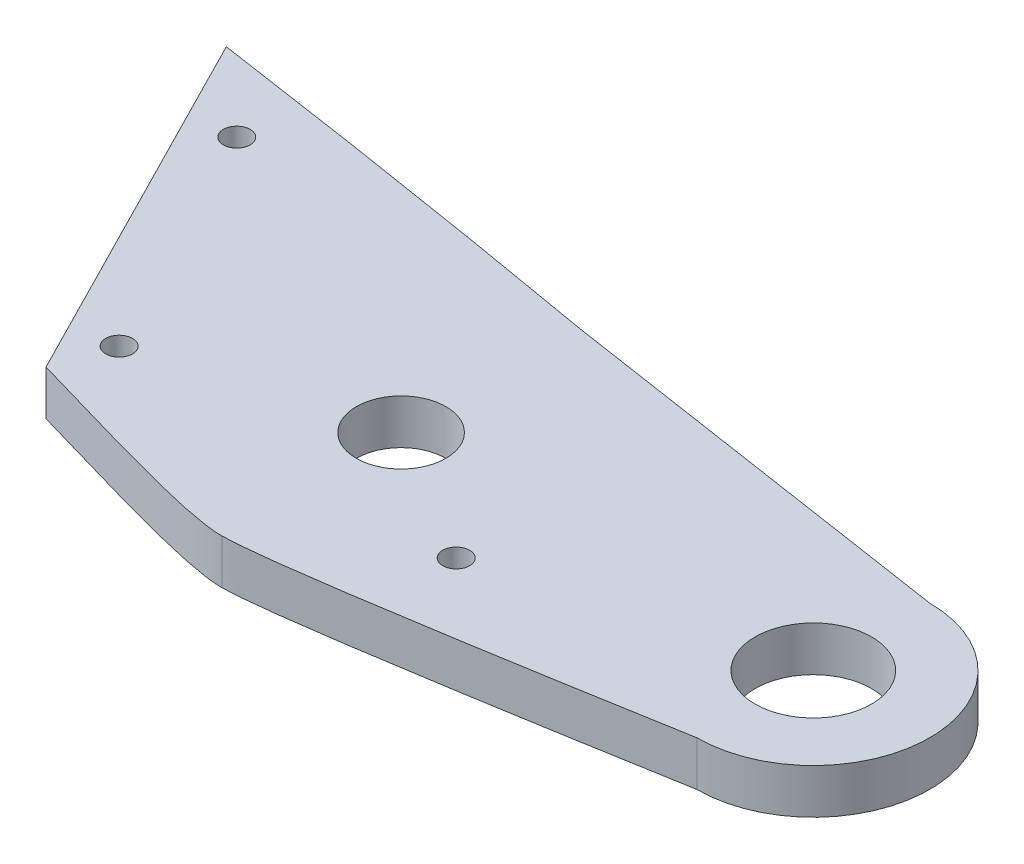
ISO-10303-21;
HEADER;
FILE_DESCRIPTION(('STEP AP214'),'2;1');
FILE_NAME('part.step','',(''),(''),'','','');
FILE_SCHEMA(('AUTOMOTIVE_DESIGN { 1 0 10303 214 1 1 1 1 }'));
ENDSEC;
DATA;
#1=APPLICATION_CONTEXT('core data for automotive mechanical design processes');
#2=APPLICATION_PROTOCOL_DEFINITION('international standard','automotive_design',2000,#1);
#3=PRODUCT_CONTEXT('',#1,'mechanical');
#4=PRODUCT('Part','Part','',(#3));
#5=PRODUCT_RELATED_PRODUCT_CATEGORY('part','',(#4));
#6=PRODUCT_DEFINITION_FORMATION('','',#4);
#7=PRODUCT_DEFINITION_CONTEXT('part definition',#1,'design');
#8=PRODUCT_DEFINITION('design','',#6,#7);
#9=PRODUCT_DEFINITION_SHAPE('','',#8);
#10=(LENGTH_UNIT() NAMED_UNIT(*) SI_UNIT(.MILLI.,.METRE.));
#11=(NAMED_UNIT(*) PLANE_ANGLE_UNIT() SI_UNIT($,.RADIAN.));
#12=(NAMED_UNIT(*) SI_UNIT($,.STERADIAN.) SOLID_ANGLE_UNIT());
#13=UNCERTAINTY_MEASURE_WITH_UNIT(LENGTH_MEASURE(1.E-05),#10,'distance_accuracy_value','');
#14=(GEOMETRIC_REPRESENTATION_CONTEXT(3) GLOBAL_UNCERTAINTY_ASSIGNED_CONTEXT((#13)) GLOBAL_UNIT_ASSIGNED_CONTEXT((#10,
#11,#12)) REPRESENTATION_CONTEXT('',''));
#15=CARTESIAN_POINT('',(0.,0.,0.));
#16=DIRECTION('',(0.,0.,1.));
#17=DIRECTION('',(1.,0.,0.));
#18=AXIS2_PLACEMENT_3D('',#15,#16,#17);
#19=CARTESIAN_POINT('',(0.,-20.,-20.));
#20=CARTESIAN_POINT('',(0.0315030304128688,-20.,-20.));
#21=CARTESIAN_POINT('',(46.0000000000001,-20.,-13.));
#22=B_SPLINE_CURVE_WITH_KNOTS('',2,(#19,#20,#21),.UNSPECIFIED.,.F.,.F.,(3,3),(0.,1.),.UNSPECIFIED.);
#23=DIRECTION('',(0.,1.,0.));
#24=VECTOR('',#23,1.);
#25=SURFACE_OF_LINEAR_EXTRUSION('',#22,#24);
#26=CARTESIAN_POINT('',(0.,-15.,-20.));
#27=CARTESIAN_POINT('',(0.0315030304128688,-15.,-20.));
#28=CARTESIAN_POINT('',(46.0000000000001,-15.,-13.));
#29=B_SPLINE_CURVE_WITH_KNOTS('',2,(#26,#27,#28),.UNSPECIFIED.,.F.,.F.,(3,3),(0.,1.),.UNSPECIFIED.);
#30=CARTESIAN_POINT('',(46.0000000000001,-15.,-13.));
#31=VERTEX_POINT('',#30);
#32=CARTESIAN_POINT('',(0.,-15.,-20.));
#33=VERTEX_POINT('',#32);
#34=EDGE_CURVE('E195',#31,#33,#29,.F.);
#35=ORIENTED_EDGE('',*,*,#34,.F.);
#36=DIRECTION('',(0.,1.,0.));
#37=VECTOR('',#36,1.);
#38=CARTESIAN_POINT('',(46.0000000000001,-20.,-13.));
#39=LINE('',#38,#37);
#40=CARTESIAN_POINT('',(46.0000000000001,-20.,-13.));
#41=VERTEX_POINT('',#40);
#42=EDGE_CURVE('E47',#41,#31,#39,.T.);
#43=ORIENTED_EDGE('',*,*,#42,.F.);
#44=CARTESIAN_POINT('',(3.0608351006138E-13,-20.,-20.));
#45=VERTEX_POINT('',#44);
#46=EDGE_CURVE('E59',#45,#41,#22,.T.);
#47=ORIENTED_EDGE('',*,*,#46,.F.);
#48=DIRECTION('',(0.,1.,0.));
#49=VECTOR('',#48,1.);
#50=CARTESIAN_POINT('',(3.0608351006138E-13,-20.,-20.));
#51=LINE('',#50,#49);
#52=EDGE_CURVE('E11',#45,#33,#51,.T.);
#53=ORIENTED_EDGE('',*,*,#52,.T.);
#54=EDGE_LOOP('',(#35,#43,#47,#53));
#55=FACE_BOUND('',#54,.T.);
#56=ADVANCED_FACE('F35',(#55),#25,.F.);
#57=CARTESIAN_POINT('',(46.,-20.,0.));
#58=DIRECTION('',(0.,1.,0.));
#59=DIRECTION('',(0.,0.,1.));
#60=AXIS2_PLACEMENT_3D('',#57,#58,#59);
#61=CYLINDRICAL_SURFACE('',#60,13.);
#62=ORIENTED_EDGE('',*,*,#42,.T.);
#63=CARTESIAN_POINT('',(46.,-15.,0.));
#64=DIRECTION('',(0.,1.,0.));
#65=DIRECTION('',(0.,0.,1.));
#66=AXIS2_PLACEMENT_3D('',#63,#64,#65);
#67=CIRCLE('',#66,13.);
#68=CARTESIAN_POINT('',(46.0000000000001,-15.,13.));
#69=VERTEX_POINT('',#68);
#70=EDGE_CURVE('E198',#31,#69,#67,.F.);
#71=ORIENTED_EDGE('',*,*,#70,.T.);
#72=DIRECTION('',(0.,1.,0.));
#73=VECTOR('',#72,1.);
#74=CARTESIAN_POINT('',(46.,-20.,13.));
#75=LINE('',#74,#73);
#76=CARTESIAN_POINT('',(46.,-20.,13.));
#77=VERTEX_POINT('',#76);
#78=EDGE_CURVE('E164',#77,#69,#75,.T.);
#79=ORIENTED_EDGE('',*,*,#78,.F.);
#80=CARTESIAN_POINT('',(46.,-20.,0.));
#81=DIRECTION('',(0.,1.,0.));
#82=DIRECTION('',(0.,0.,1.));
#83=AXIS2_PLACEMENT_3D('',#80,#81,#82);
#84=CIRCLE('',#83,13.);
#85=EDGE_CURVE('E115',#77,#41,#84,.T.);
#86=ORIENTED_EDGE('',*,*,#85,.T.);
#87=EDGE_LOOP('',(#62,#71,#79,#86));
#88=FACE_BOUND('',#87,.T.);
#89=ADVANCED_FACE('F138',(#88),#61,.T.);
#90=CARTESIAN_POINT('',(0.,-20.,20.));
#91=CARTESIAN_POINT('',(5.90849770251433,-20.,20.));
#92=CARTESIAN_POINT('',(46.0000000000001,-20.,13.));
#93=B_SPLINE_CURVE_WITH_KNOTS('',2,(#90,#91,#92),.UNSPECIFIED.,.F.,.F.,(3,3),(0.,1.),.UNSPECIFIED.);
#94=DIRECTION('',(0.,1.,0.));
#95=VECTOR('',#94,1.);
#96=SURFACE_OF_LINEAR_EXTRUSION('',#93,#95);
#97=ORIENTED_EDGE('',*,*,#78,.T.);
#98=CARTESIAN_POINT('',(0.,-15.,20.));
#99=CARTESIAN_POINT('',(5.90849770251433,-15.,20.));
#100=CARTESIAN_POINT('',(46.0000000000001,-15.,13.));
#101=B_SPLINE_CURVE_WITH_KNOTS('',2,(#98,#99,#100),.UNSPECIFIED.,.F.,.F.,(3,3),(0.,1.),.UNSPECIFIED.);
#102=CARTESIAN_POINT('',(0.,-15.,20.));
#103=VERTEX_POINT('',#102);
#104=EDGE_CURVE('E187',#69,#103,#101,.F.);
#105=ORIENTED_EDGE('',*,*,#104,.T.);
#106=DIRECTION('',(0.,1.,0.));
#107=VECTOR('',#106,1.);
#108=CARTESIAN_POINT('',(0.,-20.,20.));
#109=LINE('',#108,#107);
#110=CARTESIAN_POINT('',(0.,-20.,20.));
#111=VERTEX_POINT('',#110);
#112=EDGE_CURVE('E160',#111,#103,#109,.T.);
#113=ORIENTED_EDGE('',*,*,#112,.F.);
#114=EDGE_CURVE('E113',#111,#77,#93,.T.);
#115=ORIENTED_EDGE('',*,*,#114,.T.);
#116=EDGE_LOOP('',(#97,#105,#113,#115));
#117=FACE_BOUND('',#116,.T.);
#118=ADVANCED_FACE('F134',(#117),#96,.T.);
#119=CARTESIAN_POINT('',(0.,-20.,0.));
#120=DIRECTION('',(0.,1.,0.));
#121=DIRECTION('',(0.,0.,1.));
#122=AXIS2_PLACEMENT_3D('',#119,#120,#121);
#123=CYLINDRICAL_SURFACE('',#122,5.);
#124=CARTESIAN_POINT('',(0.,-20.,0.));
#125=DIRECTION('',(0.,1.,0.));
#126=DIRECTION('',(0.,0.,1.));
#127=AXIS2_PLACEMENT_3D('',#124,#125,#126);
#128=CIRCLE('',#127,5.);
#129=CARTESIAN_POINT('',(0.,-20.,5.));
#130=VERTEX_POINT('',#129);
#131=EDGE_CURVE('E152',#130,#130,#128,.T.);
#132=ORIENTED_EDGE('',*,*,#131,.F.);
#133=EDGE_LOOP('',(#132));
#134=FACE_BOUND('',#133,.T.);
#135=CARTESIAN_POINT('',(0.,-15.,0.));
#136=DIRECTION('',(0.,1.,0.));
#137=DIRECTION('',(0.,0.,1.));
#138=AXIS2_PLACEMENT_3D('',#135,#136,#137);
#139=CIRCLE('',#138,5.);
#140=CARTESIAN_POINT('',(0.,-15.,5.));
#141=VERTEX_POINT('',#140);
#142=EDGE_CURVE('E171',#141,#141,#139,.F.);
#143=ORIENTED_EDGE('',*,*,#142,.F.);
#144=EDGE_LOOP('',(#143));
#145=FACE_BOUND('',#144,.T.);
#146=ADVANCED_FACE('F137',(#134,#145),#123,.F.);
#147=CARTESIAN_POINT('',(46.,-20.,0.));
#148=DIRECTION('',(0.,1.,0.));
#149=DIRECTION('',(0.,0.,1.));
#150=AXIS2_PLACEMENT_3D('',#147,#148,#149);
#151=CYLINDRICAL_SURFACE('',#150,6.5);
#152=CARTESIAN_POINT('',(46.,-20.,0.));
#153=DIRECTION('',(0.,1.,0.));
#154=DIRECTION('',(0.,0.,1.));
#155=AXIS2_PLACEMENT_3D('',#152,#153,#154);
#156=CIRCLE('',#155,6.5);
#157=CARTESIAN_POINT('',(46.,-20.,6.5));
#158=VERTEX_POINT('',#157);
#159=EDGE_CURVE('E158',#158,#158,#156,.T.);
#160=ORIENTED_EDGE('',*,*,#159,.F.);
#161=EDGE_LOOP('',(#160));
#162=FACE_BOUND('',#161,.T.);
#163=CARTESIAN_POINT('',(46.,-15.,0.));
#164=DIRECTION('',(0.,1.,0.));
#165=DIRECTION('',(0.,0.,1.));
#166=AXIS2_PLACEMENT_3D('',#163,#164,#165);
#167=CIRCLE('',#166,6.5);
#168=CARTESIAN_POINT('',(46.,-15.,6.5));
#169=VERTEX_POINT('',#168);
#170=EDGE_CURVE('E168',#169,#169,#167,.F.);
#171=ORIENTED_EDGE('',*,*,#170,.F.);
#172=EDGE_LOOP('',(#171));
#173=FACE_BOUND('',#172,.T.);
#174=ADVANCED_FACE('F248',(#162,#173),#151,.F.);
#175=CARTESIAN_POINT('',(-328.284271247462,-20.,-28.284271247462));
#176=CARTESIAN_POINT('',(-300.,-20.,-56.5685424949237));
#177=CARTESIAN_POINT('',(-114.87313182139,-20.,-40.3782898364083));
#178=CARTESIAN_POINT('',(3.06083510061379E-13,-20.,-19.9999999999999));
#179=B_SPLINE_CURVE_WITH_KNOTS('',3,(#175,#176,#177,#178),.UNSPECIFIED.,.F.,.F.,(4,4),(0.,1.),.UNSPECIFIED.);
#180=DIRECTION('',(0.,1.,0.));
#181=VECTOR('',#180,1.);
#182=SURFACE_OF_LINEAR_EXTRUSION('',#179,#181);
#183=CARTESIAN_POINT('',(-47.0370499959522,-20.,-27.5275485228644));
#184=VERTEX_POINT('',#183);
#185=EDGE_CURVE('E55',#184,#45,#179,.T.);
#186=ORIENTED_EDGE('',*,*,#185,.F.);
#187=DIRECTION('',(0.,1.,0.));
#188=VECTOR('',#187,1.);
#189=CARTESIAN_POINT('',(-47.0370499959522,-30.,-27.5275485228644));
#190=LINE('',#189,#188);
#191=CARTESIAN_POINT('',(-47.0370499959522,-15.,-27.5275485228644));
#192=VERTEX_POINT('',#191);
#193=EDGE_CURVE('E97',#184,#192,#190,.T.);
#194=ORIENTED_EDGE('',*,*,#193,.T.);
#195=CARTESIAN_POINT('',(-328.284271247462,-15.,-28.284271247462));
#196=CARTESIAN_POINT('',(-300.,-15.,-56.5685424949237));
#197=CARTESIAN_POINT('',(-114.87313182139,-15.,-40.3782898364083));
#198=CARTESIAN_POINT('',(3.06083510061379E-13,-15.,-19.9999999999999));
#199=B_SPLINE_CURVE_WITH_KNOTS('',3,(#195,#196,#197,#198),.UNSPECIFIED.,.F.,.F.,(4,4),(0.,1.),.UNSPECIFIED.);
#200=EDGE_CURVE('E117',#33,#192,#199,.F.);
#201=ORIENTED_EDGE('',*,*,#200,.F.);
#202=ORIENTED_EDGE('',*,*,#52,.F.);
#203=EDGE_LOOP('',(#186,#194,#201,#202));
#204=FACE_BOUND('',#203,.T.);
#205=ADVANCED_FACE('F37',(#204),#182,.F.);
#206=CARTESIAN_POINT('',(-271.715728752538,-20.,28.2842712474621));
#207=CARTESIAN_POINT('',(-189.219937614107,-20.,-54.211519890968));
#208=CARTESIAN_POINT('',(-19.999999999993,-20.,20.0000000000001));
#209=CARTESIAN_POINT('',(0.,-20.,20.));
#210=B_SPLINE_CURVE_WITH_KNOTS('',3,(#206,#207,#208,#209),.UNSPECIFIED.,.F.,.F.,(4,4),(0.,1.),.UNSPECIFIED.);
#211=DIRECTION('',(0.,1.,0.));
#212=VECTOR('',#211,1.);
#213=SURFACE_OF_LINEAR_EXTRUSION('',#210,#212);
#214=DIRECTION('',(0.,1.,0.));
#215=VECTOR('',#214,1.);
#216=CARTESIAN_POINT('',(-26.1376583175019,-30.,13.489817143929));
#217=LINE('',#216,#215);
#218=CARTESIAN_POINT('',(-26.1376583175019,-20.,13.489817143929));
#219=VERTEX_POINT('',#218);
#220=CARTESIAN_POINT('',(-26.1376583175021,-15.,13.4898171439286));
#221=VERTEX_POINT('',#220);
#222=EDGE_CURVE('E94',#219,#221,#217,.T.);
#223=ORIENTED_EDGE('',*,*,#222,.F.);
#224=EDGE_CURVE('E105',#219,#111,#210,.T.);
#225=ORIENTED_EDGE('',*,*,#224,.T.);
#226=ORIENTED_EDGE('',*,*,#112,.T.);
#227=CARTESIAN_POINT('',(-271.715728752538,-15.,28.2842712474621));
#228=CARTESIAN_POINT('',(-189.219937614107,-15.,-54.211519890968));
#229=CARTESIAN_POINT('',(-19.999999999993,-15.,20.0000000000001));
#230=CARTESIAN_POINT('',(0.,-15.,20.));
#231=B_SPLINE_CURVE_WITH_KNOTS('',3,(#227,#228,#229,#230),.UNSPECIFIED.,.F.,.F.,(4,4),(0.,1.),.UNSPECIFIED.);
#232=EDGE_CURVE('E107',#103,#221,#231,.F.);
#233=ORIENTED_EDGE('',*,*,#232,.T.);
#234=EDGE_LOOP('',(#223,#225,#226,#233));
#235=FACE_BOUND('',#234,.T.);
#236=ADVANCED_FACE('F103',(#235),#213,.T.);
#237=CARTESIAN_POINT('',(0.,-20.,0.));
#238=DIRECTION('',(0.,1.,0.));
#239=DIRECTION('',(0.,0.,1.));
#240=AXIS2_PLACEMENT_3D('',#237,#238,#239);
#241=PLANE('',#240);
#242=CARTESIAN_POINT('',(-37.7137842876692,-20.,-19.3729697395004));
#243=DIRECTION('',(0.,-1.,0.));
#244=DIRECTION('',(0.,0.,-1.));
#245=AXIS2_PLACEMENT_3D('',#242,#243,#244);
#246=CIRCLE('',#245,1.5);
#247=CARTESIAN_POINT('',(-37.7137842876692,-20.,-20.8729697395004));
#248=VERTEX_POINT('',#247);
#249=EDGE_CURVE('E99',#248,#248,#246,.T.);
#250=ORIENTED_EDGE('',*,*,#249,.F.);
#251=EDGE_LOOP('',(#250));
#252=FACE_BOUND('',#251,.T.);
#253=CARTESIAN_POINT('',(15.2014794320323,-20.,9.052862087356));
#254=DIRECTION('',(0.,-1.,0.));
#255=DIRECTION('',(0.,0.,-1.));
#256=AXIS2_PLACEMENT_3D('',#253,#254,#255);
#257=CIRCLE('',#256,1.5);
#258=CARTESIAN_POINT('',(15.2014794320323,-20.,7.552862087356));
#259=VERTEX_POINT('',#258);
#260=EDGE_CURVE('E219',#259,#259,#257,.T.);
#261=ORIENTED_EDGE('',*,*,#260,.F.);
#262=EDGE_LOOP('',(#261));
#263=FACE_BOUND('',#262,.T.);
#264=CARTESIAN_POINT('',(-24.0758647320703,-20.,7.39295445368637));
#265=DIRECTION('',(0.,-1.,0.));
#266=DIRECTION('',(0.,0.,-1.));
#267=AXIS2_PLACEMENT_3D('',#264,#265,#266);
#268=CIRCLE('',#267,1.5);
#269=CARTESIAN_POINT('',(-24.0758647320703,-20.,5.89295445368637));
#270=VERTEX_POINT('',#269);
#271=EDGE_CURVE('E177',#270,#270,#268,.T.);
#272=ORIENTED_EDGE('',*,*,#271,.F.);
#273=EDGE_LOOP('',(#272));
#274=FACE_BOUND('',#273,.T.);
#275=ORIENTED_EDGE('',*,*,#224,.F.);
#276=DIRECTION('',(-0.453990499739548,0.,-0.891006524188367));
#277=VECTOR('',#276,1.);
#278=CARTESIAN_POINT('',(-26.2072398632191,-20.,13.3532556713151));
#279=LINE('',#278,#277);
#280=EDGE_CURVE('E91',#219,#184,#279,.T.);
#281=ORIENTED_EDGE('',*,*,#280,.T.);
#282=ORIENTED_EDGE('',*,*,#185,.T.);
#283=ORIENTED_EDGE('',*,*,#46,.T.);
#284=ORIENTED_EDGE('',*,*,#85,.F.);
#285=ORIENTED_EDGE('',*,*,#114,.F.);
#286=EDGE_LOOP('',(#275,#281,#282,#283,#284,#285));
#287=FACE_BOUND('',#286,.T.);
#288=ORIENTED_EDGE('',*,*,#131,.T.);
#289=EDGE_LOOP('',(#288));
#290=FACE_BOUND('',#289,.T.);
#291=ORIENTED_EDGE('',*,*,#159,.T.);
#292=EDGE_LOOP('',(#291));
#293=FACE_BOUND('',#292,.T.);
#294=ADVANCED_FACE('F110',(#252,#263,#274,#287,#290,#293),#241,.F.);
#295=CARTESIAN_POINT('',(0.,-15.,0.));
#296=DIRECTION('',(0.,1.,0.));
#297=DIRECTION('',(0.,0.,1.));
#298=AXIS2_PLACEMENT_3D('',#295,#296,#297);
#299=PLANE('',#298);
#300=CARTESIAN_POINT('',(-37.7137842876692,-15.,-19.3729697395004));
#301=DIRECTION('',(0.,1.,0.));
#302=DIRECTION('',(0.,0.,1.));
#303=AXIS2_PLACEMENT_3D('',#300,#301,#302);
#304=CIRCLE('',#303,1.5);
#305=CARTESIAN_POINT('',(-37.7137842876692,-15.,-17.8729697395004));
#306=VERTEX_POINT('',#305);
#307=EDGE_CURVE('E180',#306,#306,#304,.T.);
#308=ORIENTED_EDGE('',*,*,#307,.F.);
#309=EDGE_LOOP('',(#308));
#310=FACE_BOUND('',#309,.T.);
#311=CARTESIAN_POINT('',(15.2014794320323,-15.,9.052862087356));
#312=DIRECTION('',(0.,1.,0.));
#313=DIRECTION('',(0.,0.,1.));
#314=AXIS2_PLACEMENT_3D('',#311,#312,#313);
#315=CIRCLE('',#314,1.5);
#316=CARTESIAN_POINT('',(15.2014794320323,-15.,10.552862087356));
#317=VERTEX_POINT('',#316);
#318=EDGE_CURVE('E176',#317,#317,#315,.T.);
#319=ORIENTED_EDGE('',*,*,#318,.F.);
#320=EDGE_LOOP('',(#319));
#321=FACE_BOUND('',#320,.T.);
#322=CARTESIAN_POINT('',(-24.0758647320703,-15.,7.39295445368637));
#323=DIRECTION('',(0.,1.,0.));
#324=DIRECTION('',(0.,0.,1.));
#325=AXIS2_PLACEMENT_3D('',#322,#323,#324);
#326=CIRCLE('',#325,1.5);
#327=CARTESIAN_POINT('',(-24.0758647320703,-15.,8.89295445368637));
#328=VERTEX_POINT('',#327);
#329=EDGE_CURVE('E173',#328,#328,#326,.T.);
#330=ORIENTED_EDGE('',*,*,#329,.F.);
#331=EDGE_LOOP('',(#330));
#332=FACE_BOUND('',#331,.T.);
#333=ORIENTED_EDGE('',*,*,#142,.T.);
#334=EDGE_LOOP('',(#333));
#335=FACE_BOUND('',#334,.T.);
#336=ORIENTED_EDGE('',*,*,#170,.T.);
#337=EDGE_LOOP('',(#336));
#338=FACE_BOUND('',#337,.T.);
#339=ORIENTED_EDGE('',*,*,#200,.T.);
#340=DIRECTION('',(0.453990499739548,0.,0.891006524188367));
#341=VECTOR('',#340,1.);
#342=CARTESIAN_POINT('',(-17.2627680221852,-15.,30.9077700727233));
#343=LINE('',#342,#341);
#344=EDGE_CURVE('E172',#192,#221,#343,.T.);
#345=ORIENTED_EDGE('',*,*,#344,.T.);
#346=ORIENTED_EDGE('',*,*,#232,.F.);
#347=ORIENTED_EDGE('',*,*,#104,.F.);
#348=ORIENTED_EDGE('',*,*,#70,.F.);
#349=ORIENTED_EDGE('',*,*,#34,.T.);
#350=EDGE_LOOP('',(#339,#345,#346,#347,#348,#349));
#351=FACE_BOUND('',#350,.T.);
#352=ADVANCED_FACE('F231',(#310,#321,#332,#335,#338,#351),#299,.T.);
#353=CARTESIAN_POINT('',(-24.0758647320703,-10.,7.39295445368637));
#354=DIRECTION('',(0.,-1.,0.));
#355=DIRECTION('',(0.,0.,-1.));
#356=AXIS2_PLACEMENT_3D('',#353,#354,#355);
#357=CYLINDRICAL_SURFACE('',#356,1.5);
#358=ORIENTED_EDGE('',*,*,#329,.T.);
#359=EDGE_LOOP('',(#358));
#360=FACE_BOUND('',#359,.T.);
#361=ORIENTED_EDGE('',*,*,#271,.T.);
#362=EDGE_LOOP('',(#361));
#363=FACE_BOUND('',#362,.T.);
#364=ADVANCED_FACE('F233',(#360,#363),#357,.F.);
#365=CARTESIAN_POINT('',(15.2014794320323,-10.,9.052862087356));
#366=DIRECTION('',(0.,-1.,0.));
#367=DIRECTION('',(0.,0.,-1.));
#368=AXIS2_PLACEMENT_3D('',#365,#366,#367);
#369=CYLINDRICAL_SURFACE('',#368,1.5);
#370=ORIENTED_EDGE('',*,*,#318,.T.);
#371=EDGE_LOOP('',(#370));
#372=FACE_BOUND('',#371,.T.);
#373=ORIENTED_EDGE('',*,*,#260,.T.);
#374=EDGE_LOOP('',(#373));
#375=FACE_BOUND('',#374,.T.);
#376=ADVANCED_FACE('F240',(#372,#375),#369,.F.);
#377=CARTESIAN_POINT('',(-37.7137842876692,-10.,-19.3729697395004));
#378=DIRECTION('',(0.,-1.,0.));
#379=DIRECTION('',(0.,0.,-1.));
#380=AXIS2_PLACEMENT_3D('',#377,#378,#379);
#381=CYLINDRICAL_SURFACE('',#380,1.5);
#382=ORIENTED_EDGE('',*,*,#307,.T.);
#383=EDGE_LOOP('',(#382));
#384=FACE_BOUND('',#383,.T.);
#385=ORIENTED_EDGE('',*,*,#249,.T.);
#386=EDGE_LOOP('',(#385));
#387=FACE_BOUND('',#386,.T.);
#388=ADVANCED_FACE('F302',(#384,#387),#381,.F.);
#389=CARTESIAN_POINT('',(-47.0370499959522,-30.,-27.5275485228644));
#390=DIRECTION('',(0.891006524188367,0.,-0.453990499739548));
#391=DIRECTION('',(-0.453990499739548,0.,-0.891006524188367));
#392=AXIS2_PLACEMENT_3D('',#389,#390,#391);
#393=PLANE('',#392);
#394=ORIENTED_EDGE('',*,*,#222,.T.);
#395=ORIENTED_EDGE('',*,*,#344,.F.);
#396=ORIENTED_EDGE('',*,*,#193,.F.);
#397=ORIENTED_EDGE('',*,*,#280,.F.);
#398=EDGE_LOOP('',(#394,#395,#396,#397));
#399=FACE_BOUND('',#398,.T.);
#400=ADVANCED_FACE('F93',(#399),#393,.F.);
#401=CLOSED_SHELL('',(#56,#89,#118,#146,#174,#205,#236,#294,#352,#364,#376,#388,#400));
#402=MANIFOLD_SOLID_BREP('B2',#401);
#403=ADVANCED_BREP_SHAPE_REPRESENTATION('',(#18,#402),#14);
#404=SHAPE_DEFINITION_REPRESENTATION(#9,#403);
ENDSEC;
END-ISO-10303-21;
